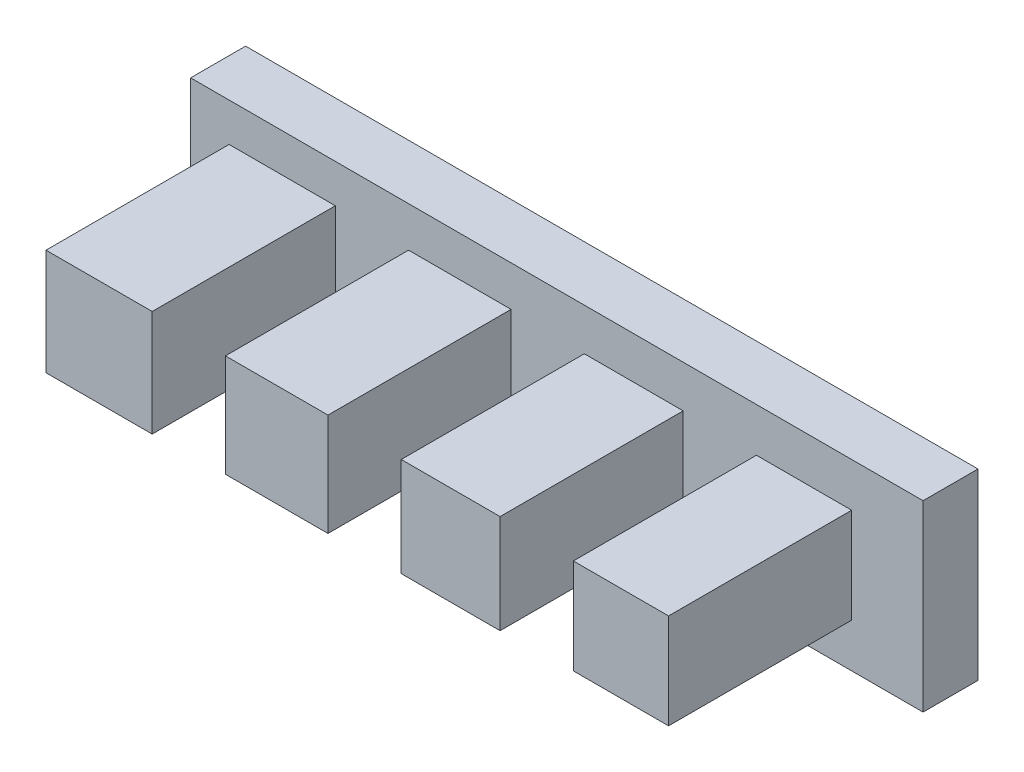
ISO-10303-21;
HEADER;
FILE_DESCRIPTION(('STEP AP214'),'2;1');
FILE_NAME('part.step','',(''),(''),'','','');
FILE_SCHEMA(('AUTOMOTIVE_DESIGN { 1 0 10303 214 1 1 1 1 }'));
ENDSEC;
DATA;
#1=APPLICATION_CONTEXT('core data for automotive mechanical design processes');
#2=APPLICATION_PROTOCOL_DEFINITION('international standard','automotive_design',2000,#1);
#3=PRODUCT_CONTEXT('',#1,'mechanical');
#4=PRODUCT('Part','Part','',(#3));
#5=PRODUCT_RELATED_PRODUCT_CATEGORY('part','',(#4));
#6=PRODUCT_DEFINITION_FORMATION('','',#4);
#7=PRODUCT_DEFINITION_CONTEXT('part definition',#1,'design');
#8=PRODUCT_DEFINITION('design','',#6,#7);
#9=PRODUCT_DEFINITION_SHAPE('','',#8);
#10=(LENGTH_UNIT() NAMED_UNIT(*) SI_UNIT(.MILLI.,.METRE.));
#11=(NAMED_UNIT(*) PLANE_ANGLE_UNIT() SI_UNIT($,.RADIAN.));
#12=(NAMED_UNIT(*) SI_UNIT($,.STERADIAN.) SOLID_ANGLE_UNIT());
#13=UNCERTAINTY_MEASURE_WITH_UNIT(LENGTH_MEASURE(1.E-05),#10,'distance_accuracy_value','');
#14=(GEOMETRIC_REPRESENTATION_CONTEXT(3) GLOBAL_UNCERTAINTY_ASSIGNED_CONTEXT((#13)) GLOBAL_UNIT_ASSIGNED_CONTEXT((#10,
#11,#12)) REPRESENTATION_CONTEXT('',''));
#15=CARTESIAN_POINT('',(0.,0.,0.));
#16=DIRECTION('',(0.,0.,1.));
#17=DIRECTION('',(1.,0.,0.));
#18=AXIS2_PLACEMENT_3D('',#15,#16,#17);
#19=CARTESIAN_POINT('',(0.,0.,1.5));
#20=DIRECTION('',(0.,0.,-1.));
#21=DIRECTION('',(-1.,0.,0.));
#22=AXIS2_PLACEMENT_3D('',#19,#20,#21);
#23=PLANE('',#22);
#24=DIRECTION('',(0.,-1.,0.));
#25=VECTOR('',#24,1.);
#26=CARTESIAN_POINT('',(10.75,3.85,1.5));
#27=LINE('',#26,#25);
#28=CARTESIAN_POINT('',(10.75,3.85,1.5));
#29=VERTEX_POINT('',#28);
#30=CARTESIAN_POINT('',(10.75,1.15,1.5));
#31=VERTEX_POINT('',#30);
#32=EDGE_CURVE('E191',#29,#31,#27,.T.);
#33=ORIENTED_EDGE('',*,*,#32,.F.);
#34=DIRECTION('',(-1.,0.,0.));
#35=VECTOR('',#34,1.);
#36=CARTESIAN_POINT('',(10.75,3.85,1.5));
#37=LINE('',#36,#35);
#38=CARTESIAN_POINT('',(13.45,3.85,1.5));
#39=VERTEX_POINT('',#38);
#40=EDGE_CURVE('E204',#39,#29,#37,.T.);
#41=ORIENTED_EDGE('',*,*,#40,.F.);
#42=DIRECTION('',(0.,1.,0.));
#43=VECTOR('',#42,1.);
#44=CARTESIAN_POINT('',(13.45,3.85,1.5));
#45=LINE('',#44,#43);
#46=CARTESIAN_POINT('',(13.45,1.15,1.5));
#47=VERTEX_POINT('',#46);
#48=EDGE_CURVE('E213',#47,#39,#45,.T.);
#49=ORIENTED_EDGE('',*,*,#48,.F.);
#50=DIRECTION('',(1.,0.,0.));
#51=VECTOR('',#50,1.);
#52=CARTESIAN_POINT('',(10.75,1.15,1.5));
#53=LINE('',#52,#51);
#54=EDGE_CURVE('E194',#31,#47,#53,.T.);
#55=ORIENTED_EDGE('',*,*,#54,.F.);
#56=EDGE_LOOP('',(#33,#41,#49,#55));
#57=FACE_BOUND('',#56,.T.);
#58=DIRECTION('',(0.,-1.,0.));
#59=VECTOR('',#58,1.);
#60=CARTESIAN_POINT('',(1.05,1.05,1.5));
#61=LINE('',#60,#59);
#62=CARTESIAN_POINT('',(1.05,3.95,1.5));
#63=VERTEX_POINT('',#62);
#64=CARTESIAN_POINT('',(1.05,1.05,1.5));
#65=VERTEX_POINT('',#64);
#66=EDGE_CURVE('E262',#63,#65,#61,.T.);
#67=ORIENTED_EDGE('',*,*,#66,.F.);
#68=DIRECTION('',(-1.,0.,0.));
#69=VECTOR('',#68,1.);
#70=CARTESIAN_POINT('',(1.05,3.95,1.5));
#71=LINE('',#70,#69);
#72=CARTESIAN_POINT('',(3.95,3.95,1.5));
#73=VERTEX_POINT('',#72);
#74=EDGE_CURVE('E267',#73,#63,#71,.T.);
#75=ORIENTED_EDGE('',*,*,#74,.F.);
#76=DIRECTION('',(0.,1.,0.));
#77=VECTOR('',#76,1.);
#78=CARTESIAN_POINT('',(3.95,1.05,1.5));
#79=LINE('',#78,#77);
#80=CARTESIAN_POINT('',(3.95,1.05,1.5));
#81=VERTEX_POINT('',#80);
#82=EDGE_CURVE('E279',#81,#73,#79,.T.);
#83=ORIENTED_EDGE('',*,*,#82,.F.);
#84=DIRECTION('',(1.,0.,0.));
#85=VECTOR('',#84,1.);
#86=CARTESIAN_POINT('',(1.05,1.05,1.5));
#87=LINE('',#86,#85);
#88=EDGE_CURVE('E276',#65,#81,#87,.T.);
#89=ORIENTED_EDGE('',*,*,#88,.F.);
#90=EDGE_LOOP('',(#67,#75,#83,#89));
#91=FACE_BOUND('',#90,.T.);
#92=DIRECTION('',(0.,-1.,0.));
#93=VECTOR('',#92,1.);
#94=CARTESIAN_POINT('',(0.,0.,1.5));
#95=LINE('',#94,#93);
#96=CARTESIAN_POINT('',(0.,5.,1.5));
#97=VERTEX_POINT('',#96);
#98=CARTESIAN_POINT('',(0.,0.,1.5));
#99=VERTEX_POINT('',#98);
#100=EDGE_CURVE('E296',#97,#99,#95,.T.);
#101=ORIENTED_EDGE('',*,*,#100,.T.);
#102=DIRECTION('',(1.,0.,0.));
#103=VECTOR('',#102,1.);
#104=CARTESIAN_POINT('',(0.,0.,1.5));
#105=LINE('',#104,#103);
#106=CARTESIAN_POINT('',(20.,0.,1.5));
#107=VERTEX_POINT('',#106);
#108=EDGE_CURVE('E299',#99,#107,#105,.T.);
#109=ORIENTED_EDGE('',*,*,#108,.T.);
#110=DIRECTION('',(0.,1.,0.));
#111=VECTOR('',#110,1.);
#112=CARTESIAN_POINT('',(20.,0.,1.5));
#113=LINE('',#112,#111);
#114=CARTESIAN_POINT('',(20.,5.,1.5));
#115=VERTEX_POINT('',#114);
#116=EDGE_CURVE('E302',#107,#115,#113,.T.);
#117=ORIENTED_EDGE('',*,*,#116,.T.);
#118=DIRECTION('',(-1.,0.,0.));
#119=VECTOR('',#118,1.);
#120=CARTESIAN_POINT('',(0.,5.,1.5));
#121=LINE('',#120,#119);
#122=EDGE_CURVE('E304',#115,#97,#121,.T.);
#123=ORIENTED_EDGE('',*,*,#122,.T.);
#124=EDGE_LOOP('',(#101,#109,#117,#123));
#125=FACE_BOUND('',#124,.T.);
#126=DIRECTION('',(0.,-1.,0.));
#127=VECTOR('',#126,1.);
#128=CARTESIAN_POINT('',(5.95,3.9,1.5));
#129=LINE('',#128,#127);
#130=CARTESIAN_POINT('',(5.95,3.9,1.5));
#131=VERTEX_POINT('',#130);
#132=CARTESIAN_POINT('',(5.95,1.1,1.5));
#133=VERTEX_POINT('',#132);
#134=EDGE_CURVE('E229',#131,#133,#129,.T.);
#135=ORIENTED_EDGE('',*,*,#134,.F.);
#136=DIRECTION('',(-1.,0.,0.));
#137=VECTOR('',#136,1.);
#138=CARTESIAN_POINT('',(5.95,3.9,1.5));
#139=LINE('',#138,#137);
#140=CARTESIAN_POINT('',(8.75,3.9,1.5));
#141=VERTEX_POINT('',#140);
#142=EDGE_CURVE('E234',#141,#131,#139,.T.);
#143=ORIENTED_EDGE('',*,*,#142,.F.);
#144=DIRECTION('',(0.,1.,0.));
#145=VECTOR('',#144,1.);
#146=CARTESIAN_POINT('',(8.75,3.9,1.5));
#147=LINE('',#146,#145);
#148=CARTESIAN_POINT('',(8.75,1.1,1.5));
#149=VERTEX_POINT('',#148);
#150=EDGE_CURVE('E246',#149,#141,#147,.T.);
#151=ORIENTED_EDGE('',*,*,#150,.F.);
#152=DIRECTION('',(1.,0.,0.));
#153=VECTOR('',#152,1.);
#154=CARTESIAN_POINT('',(5.95,1.1,1.5));
#155=LINE('',#154,#153);
#156=EDGE_CURVE('E243',#133,#149,#155,.T.);
#157=ORIENTED_EDGE('',*,*,#156,.F.);
#158=EDGE_LOOP('',(#135,#143,#151,#157));
#159=FACE_BOUND('',#158,.T.);
#160=DIRECTION('',(0.,-1.,0.));
#161=VECTOR('',#160,1.);
#162=CARTESIAN_POINT('',(15.45,3.8,1.5));
#163=LINE('',#162,#161);
#164=CARTESIAN_POINT('',(15.45,3.8,1.5));
#165=VERTEX_POINT('',#164);
#166=CARTESIAN_POINT('',(15.45,1.2,1.5));
#167=VERTEX_POINT('',#166);
#168=EDGE_CURVE('E190',#165,#167,#163,.T.);
#169=ORIENTED_EDGE('',*,*,#168,.F.);
#170=DIRECTION('',(-1.,0.,0.));
#171=VECTOR('',#170,1.);
#172=CARTESIAN_POINT('',(15.45,3.8,1.5));
#173=LINE('',#172,#171);
#174=CARTESIAN_POINT('',(18.05,3.8,1.5));
#175=VERTEX_POINT('',#174);
#176=EDGE_CURVE('E187',#175,#165,#173,.T.);
#177=ORIENTED_EDGE('',*,*,#176,.F.);
#178=DIRECTION('',(0.,1.,0.));
#179=VECTOR('',#178,1.);
#180=CARTESIAN_POINT('',(18.05,3.8,1.5));
#181=LINE('',#180,#179);
#182=CARTESIAN_POINT('',(18.05,1.2,1.5));
#183=VERTEX_POINT('',#182);
#184=EDGE_CURVE('E53',#183,#175,#181,.T.);
#185=ORIENTED_EDGE('',*,*,#184,.F.);
#186=DIRECTION('',(1.,0.,0.));
#187=VECTOR('',#186,1.);
#188=CARTESIAN_POINT('',(15.45,1.2,1.5));
#189=LINE('',#188,#187);
#190=EDGE_CURVE('E48',#167,#183,#189,.T.);
#191=ORIENTED_EDGE('',*,*,#190,.F.);
#192=EDGE_LOOP('',(#169,#177,#185,#191));
#193=FACE_BOUND('',#192,.T.);
#194=ADVANCED_FACE('F33',(#57,#91,#125,#159,#193),#23,.F.);
#195=CARTESIAN_POINT('',(0.,0.,1.5));
#196=DIRECTION('',(1.,0.,0.));
#197=DIRECTION('',(0.,0.,-1.));
#198=AXIS2_PLACEMENT_3D('',#195,#196,#197);
#199=PLANE('',#198);
#200=DIRECTION('',(0.,-1.,0.));
#201=VECTOR('',#200,1.);
#202=CARTESIAN_POINT('',(0.,0.,0.));
#203=LINE('',#202,#201);
#204=CARTESIAN_POINT('',(0.,5.,0.));
#205=VERTEX_POINT('',#204);
#206=CARTESIAN_POINT('',(0.,0.,0.));
#207=VERTEX_POINT('',#206);
#208=EDGE_CURVE('E295',#205,#207,#203,.T.);
#209=ORIENTED_EDGE('',*,*,#208,.T.);
#210=DIRECTION('',(0.,0.,-1.));
#211=VECTOR('',#210,1.);
#212=CARTESIAN_POINT('',(0.,0.,1.5));
#213=LINE('',#212,#211);
#214=EDGE_CURVE('E11',#99,#207,#213,.T.);
#215=ORIENTED_EDGE('',*,*,#214,.F.);
#216=ORIENTED_EDGE('',*,*,#100,.F.);
#217=DIRECTION('',(0.,0.,-1.));
#218=VECTOR('',#217,1.);
#219=CARTESIAN_POINT('',(0.,5.,1.5));
#220=LINE('',#219,#218);
#221=EDGE_CURVE('E306',#97,#205,#220,.T.);
#222=ORIENTED_EDGE('',*,*,#221,.T.);
#223=EDGE_LOOP('',(#209,#215,#216,#222));
#224=FACE_BOUND('',#223,.T.);
#225=ADVANCED_FACE('F35',(#224),#199,.F.);
#226=CARTESIAN_POINT('',(0.,0.,1.5));
#227=DIRECTION('',(0.,1.,0.));
#228=DIRECTION('',(0.,0.,1.));
#229=AXIS2_PLACEMENT_3D('',#226,#227,#228);
#230=PLANE('',#229);
#231=DIRECTION('',(1.,0.,0.));
#232=VECTOR('',#231,1.);
#233=CARTESIAN_POINT('',(0.,0.,0.));
#234=LINE('',#233,#232);
#235=CARTESIAN_POINT('',(20.,0.,0.));
#236=VERTEX_POINT('',#235);
#237=EDGE_CURVE('E309',#207,#236,#234,.T.);
#238=ORIENTED_EDGE('',*,*,#237,.T.);
#239=DIRECTION('',(0.,0.,-1.));
#240=VECTOR('',#239,1.);
#241=CARTESIAN_POINT('',(20.,0.,1.5));
#242=LINE('',#241,#240);
#243=EDGE_CURVE('E41',#107,#236,#242,.T.);
#244=ORIENTED_EDGE('',*,*,#243,.F.);
#245=ORIENTED_EDGE('',*,*,#108,.F.);
#246=ORIENTED_EDGE('',*,*,#214,.T.);
#247=EDGE_LOOP('',(#238,#244,#245,#246));
#248=FACE_BOUND('',#247,.T.);
#249=ADVANCED_FACE('F339',(#248),#230,.F.);
#250=CARTESIAN_POINT('',(20.,0.,1.5));
#251=DIRECTION('',(-1.,0.,0.));
#252=DIRECTION('',(0.,0.,1.));
#253=AXIS2_PLACEMENT_3D('',#250,#251,#252);
#254=PLANE('',#253);
#255=DIRECTION('',(0.,1.,0.));
#256=VECTOR('',#255,1.);
#257=CARTESIAN_POINT('',(20.,0.,0.));
#258=LINE('',#257,#256);
#259=CARTESIAN_POINT('',(20.,5.,0.));
#260=VERTEX_POINT('',#259);
#261=EDGE_CURVE('E311',#236,#260,#258,.T.);
#262=ORIENTED_EDGE('',*,*,#261,.T.);
#263=DIRECTION('',(0.,0.,-1.));
#264=VECTOR('',#263,1.);
#265=CARTESIAN_POINT('',(20.,5.,1.5));
#266=LINE('',#265,#264);
#267=EDGE_CURVE('E316',#115,#260,#266,.T.);
#268=ORIENTED_EDGE('',*,*,#267,.F.);
#269=ORIENTED_EDGE('',*,*,#116,.F.);
#270=ORIENTED_EDGE('',*,*,#243,.T.);
#271=EDGE_LOOP('',(#262,#268,#269,#270));
#272=FACE_BOUND('',#271,.T.);
#273=ADVANCED_FACE('F323',(#272),#254,.F.);
#274=CARTESIAN_POINT('',(0.,5.,1.5));
#275=DIRECTION('',(0.,-1.,0.));
#276=DIRECTION('',(0.,0.,-1.));
#277=AXIS2_PLACEMENT_3D('',#274,#275,#276);
#278=PLANE('',#277);
#279=DIRECTION('',(-1.,0.,0.));
#280=VECTOR('',#279,1.);
#281=CARTESIAN_POINT('',(0.,5.,0.));
#282=LINE('',#281,#280);
#283=EDGE_CURVE('E300',#260,#205,#282,.T.);
#284=ORIENTED_EDGE('',*,*,#283,.T.);
#285=ORIENTED_EDGE('',*,*,#221,.F.);
#286=ORIENTED_EDGE('',*,*,#122,.F.);
#287=ORIENTED_EDGE('',*,*,#267,.T.);
#288=EDGE_LOOP('',(#284,#285,#286,#287));
#289=FACE_BOUND('',#288,.T.);
#290=ADVANCED_FACE('F332',(#289),#278,.F.);
#291=CARTESIAN_POINT('',(0.,0.,0.));
#292=DIRECTION('',(0.,0.,-1.));
#293=DIRECTION('',(-1.,0.,0.));
#294=AXIS2_PLACEMENT_3D('',#291,#292,#293);
#295=PLANE('',#294);
#296=ORIENTED_EDGE('',*,*,#208,.F.);
#297=ORIENTED_EDGE('',*,*,#283,.F.);
#298=ORIENTED_EDGE('',*,*,#261,.F.);
#299=ORIENTED_EDGE('',*,*,#237,.F.);
#300=EDGE_LOOP('',(#296,#297,#298,#299));
#301=FACE_BOUND('',#300,.T.);
#302=ADVANCED_FACE('F329',(#301),#295,.T.);
#303=CARTESIAN_POINT('',(1.05,1.05,6.5));
#304=DIRECTION('',(1.,0.,0.));
#305=DIRECTION('',(0.,1.,0.));
#306=AXIS2_PLACEMENT_3D('',#303,#304,#305);
#307=PLANE('',#306);
#308=ORIENTED_EDGE('',*,*,#66,.T.);
#309=DIRECTION('',(0.,0.,-1.));
#310=VECTOR('',#309,1.);
#311=CARTESIAN_POINT('',(1.05,1.05,6.5));
#312=LINE('',#311,#310);
#313=CARTESIAN_POINT('',(1.05,1.05,6.5));
#314=VERTEX_POINT('',#313);
#315=EDGE_CURVE('E292',#314,#65,#312,.T.);
#316=ORIENTED_EDGE('',*,*,#315,.F.);
#317=DIRECTION('',(0.,-1.,0.));
#318=VECTOR('',#317,1.);
#319=CARTESIAN_POINT('',(1.05,1.05,6.5));
#320=LINE('',#319,#318);
#321=CARTESIAN_POINT('',(1.05,3.95,6.5));
#322=VERTEX_POINT('',#321);
#323=EDGE_CURVE('E263',#322,#314,#320,.T.);
#324=ORIENTED_EDGE('',*,*,#323,.F.);
#325=DIRECTION('',(0.,0.,-1.));
#326=VECTOR('',#325,1.);
#327=CARTESIAN_POINT('',(1.05,3.95,6.5));
#328=LINE('',#327,#326);
#329=EDGE_CURVE('E273',#322,#63,#328,.T.);
#330=ORIENTED_EDGE('',*,*,#329,.T.);
#331=EDGE_LOOP('',(#308,#316,#324,#330));
#332=FACE_BOUND('',#331,.T.);
#333=ADVANCED_FACE('F354',(#332),#307,.F.);
#334=CARTESIAN_POINT('',(1.05,1.05,6.5));
#335=DIRECTION('',(0.,1.,0.));
#336=DIRECTION('',(0.,0.,1.));
#337=AXIS2_PLACEMENT_3D('',#334,#335,#336);
#338=PLANE('',#337);
#339=ORIENTED_EDGE('',*,*,#88,.T.);
#340=DIRECTION('',(0.,0.,-1.));
#341=VECTOR('',#340,1.);
#342=CARTESIAN_POINT('',(3.95,1.05,6.5));
#343=LINE('',#342,#341);
#344=CARTESIAN_POINT('',(3.95,1.05,6.5));
#345=VERTEX_POINT('',#344);
#346=EDGE_CURVE('E289',#345,#81,#343,.T.);
#347=ORIENTED_EDGE('',*,*,#346,.F.);
#348=DIRECTION('',(1.,0.,0.));
#349=VECTOR('',#348,1.);
#350=CARTESIAN_POINT('',(1.05,1.05,6.5));
#351=LINE('',#350,#349);
#352=EDGE_CURVE('E266',#314,#345,#351,.T.);
#353=ORIENTED_EDGE('',*,*,#352,.F.);
#354=ORIENTED_EDGE('',*,*,#315,.T.);
#355=EDGE_LOOP('',(#339,#347,#353,#354));
#356=FACE_BOUND('',#355,.T.);
#357=ADVANCED_FACE('F373',(#356),#338,.F.);
#358=CARTESIAN_POINT('',(3.95,1.05,6.5));
#359=DIRECTION('',(-1.,0.,0.));
#360=DIRECTION('',(0.,0.,1.));
#361=AXIS2_PLACEMENT_3D('',#358,#359,#360);
#362=PLANE('',#361);
#363=ORIENTED_EDGE('',*,*,#82,.T.);
#364=DIRECTION('',(0.,0.,-1.));
#365=VECTOR('',#364,1.);
#366=CARTESIAN_POINT('',(3.95,3.95,6.5));
#367=LINE('',#366,#365);
#368=CARTESIAN_POINT('',(3.95,3.95,6.5));
#369=VERTEX_POINT('',#368);
#370=EDGE_CURVE('E286',#369,#73,#367,.T.);
#371=ORIENTED_EDGE('',*,*,#370,.F.);
#372=DIRECTION('',(0.,1.,0.));
#373=VECTOR('',#372,1.);
#374=CARTESIAN_POINT('',(3.95,1.05,6.5));
#375=LINE('',#374,#373);
#376=EDGE_CURVE('E269',#345,#369,#375,.T.);
#377=ORIENTED_EDGE('',*,*,#376,.F.);
#378=ORIENTED_EDGE('',*,*,#346,.T.);
#379=EDGE_LOOP('',(#363,#371,#377,#378));
#380=FACE_BOUND('',#379,.T.);
#381=ADVANCED_FACE('F380',(#380),#362,.F.);
#382=CARTESIAN_POINT('',(1.05,3.95,6.5));
#383=DIRECTION('',(0.,-1.,0.));
#384=DIRECTION('',(0.,0.,-1.));
#385=AXIS2_PLACEMENT_3D('',#382,#383,#384);
#386=PLANE('',#385);
#387=ORIENTED_EDGE('',*,*,#74,.T.);
#388=ORIENTED_EDGE('',*,*,#329,.F.);
#389=DIRECTION('',(-1.,0.,0.));
#390=VECTOR('',#389,1.);
#391=CARTESIAN_POINT('',(1.05,3.95,6.5));
#392=LINE('',#391,#390);
#393=EDGE_CURVE('E271',#369,#322,#392,.T.);
#394=ORIENTED_EDGE('',*,*,#393,.F.);
#395=ORIENTED_EDGE('',*,*,#370,.T.);
#396=EDGE_LOOP('',(#387,#388,#394,#395));
#397=FACE_BOUND('',#396,.T.);
#398=ADVANCED_FACE('F387',(#397),#386,.F.);
#399=CARTESIAN_POINT('',(0.,0.,6.5));
#400=DIRECTION('',(0.,0.,-1.));
#401=DIRECTION('',(-1.,0.,0.));
#402=AXIS2_PLACEMENT_3D('',#399,#400,#401);
#403=PLANE('',#402);
#404=ORIENTED_EDGE('',*,*,#323,.T.);
#405=ORIENTED_EDGE('',*,*,#352,.T.);
#406=ORIENTED_EDGE('',*,*,#376,.T.);
#407=ORIENTED_EDGE('',*,*,#393,.T.);
#408=EDGE_LOOP('',(#404,#405,#406,#407));
#409=FACE_BOUND('',#408,.T.);
#410=ADVANCED_FACE('F395',(#409),#403,.F.);
#411=CARTESIAN_POINT('',(5.95,3.9,6.5));
#412=DIRECTION('',(1.,0.,0.));
#413=DIRECTION('',(0.,0.,-1.));
#414=AXIS2_PLACEMENT_3D('',#411,#412,#413);
#415=PLANE('',#414);
#416=ORIENTED_EDGE('',*,*,#134,.T.);
#417=DIRECTION('',(0.,0.,-1.));
#418=VECTOR('',#417,1.);
#419=CARTESIAN_POINT('',(5.95,1.1,6.5));
#420=LINE('',#419,#418);
#421=CARTESIAN_POINT('',(5.95,1.1,6.5));
#422=VERTEX_POINT('',#421);
#423=EDGE_CURVE('E259',#422,#133,#420,.T.);
#424=ORIENTED_EDGE('',*,*,#423,.F.);
#425=DIRECTION('',(0.,-1.,0.));
#426=VECTOR('',#425,1.);
#427=CARTESIAN_POINT('',(5.95,3.9,6.5));
#428=LINE('',#427,#426);
#429=CARTESIAN_POINT('',(5.95,3.9,6.5));
#430=VERTEX_POINT('',#429);
#431=EDGE_CURVE('E230',#430,#422,#428,.T.);
#432=ORIENTED_EDGE('',*,*,#431,.F.);
#433=DIRECTION('',(0.,0.,-1.));
#434=VECTOR('',#433,1.);
#435=CARTESIAN_POINT('',(5.95,3.9,6.5));
#436=LINE('',#435,#434);
#437=EDGE_CURVE('E240',#430,#131,#436,.T.);
#438=ORIENTED_EDGE('',*,*,#437,.T.);
#439=EDGE_LOOP('',(#416,#424,#432,#438));
#440=FACE_BOUND('',#439,.T.);
#441=ADVANCED_FACE('F403',(#440),#415,.F.);
#442=CARTESIAN_POINT('',(5.95,1.1,6.5));
#443=DIRECTION('',(0.,1.,0.));
#444=DIRECTION('',(0.,0.,1.));
#445=AXIS2_PLACEMENT_3D('',#442,#443,#444);
#446=PLANE('',#445);
#447=ORIENTED_EDGE('',*,*,#156,.T.);
#448=DIRECTION('',(0.,0.,-1.));
#449=VECTOR('',#448,1.);
#450=CARTESIAN_POINT('',(8.75,1.1,6.5));
#451=LINE('',#450,#449);
#452=CARTESIAN_POINT('',(8.75,1.1,6.5));
#453=VERTEX_POINT('',#452);
#454=EDGE_CURVE('E256',#453,#149,#451,.T.);
#455=ORIENTED_EDGE('',*,*,#454,.F.);
#456=DIRECTION('',(1.,0.,0.));
#457=VECTOR('',#456,1.);
#458=CARTESIAN_POINT('',(5.95,1.1,6.5));
#459=LINE('',#458,#457);
#460=EDGE_CURVE('E233',#422,#453,#459,.T.);
#461=ORIENTED_EDGE('',*,*,#460,.F.);
#462=ORIENTED_EDGE('',*,*,#423,.T.);
#463=EDGE_LOOP('',(#447,#455,#461,#462));
#464=FACE_BOUND('',#463,.T.);
#465=ADVANCED_FACE('F411',(#464),#446,.F.);
#466=CARTESIAN_POINT('',(8.75,3.9,6.5));
#467=DIRECTION('',(-1.,0.,0.));
#468=DIRECTION('',(0.,0.,1.));
#469=AXIS2_PLACEMENT_3D('',#466,#467,#468);
#470=PLANE('',#469);
#471=ORIENTED_EDGE('',*,*,#150,.T.);
#472=DIRECTION('',(0.,0.,-1.));
#473=VECTOR('',#472,1.);
#474=CARTESIAN_POINT('',(8.75,3.9,6.5));
#475=LINE('',#474,#473);
#476=CARTESIAN_POINT('',(8.75,3.9,6.5));
#477=VERTEX_POINT('',#476);
#478=EDGE_CURVE('E253',#477,#141,#475,.T.);
#479=ORIENTED_EDGE('',*,*,#478,.F.);
#480=DIRECTION('',(0.,1.,0.));
#481=VECTOR('',#480,1.);
#482=CARTESIAN_POINT('',(8.75,3.9,6.5));
#483=LINE('',#482,#481);
#484=EDGE_CURVE('E236',#453,#477,#483,.T.);
#485=ORIENTED_EDGE('',*,*,#484,.F.);
#486=ORIENTED_EDGE('',*,*,#454,.T.);
#487=EDGE_LOOP('',(#471,#479,#485,#486));
#488=FACE_BOUND('',#487,.T.);
#489=ADVANCED_FACE('F419',(#488),#470,.F.);
#490=CARTESIAN_POINT('',(5.95,3.9,6.5));
#491=DIRECTION('',(0.,-1.,0.));
#492=DIRECTION('',(0.,0.,-1.));
#493=AXIS2_PLACEMENT_3D('',#490,#491,#492);
#494=PLANE('',#493);
#495=ORIENTED_EDGE('',*,*,#142,.T.);
#496=ORIENTED_EDGE('',*,*,#437,.F.);
#497=DIRECTION('',(-1.,0.,0.));
#498=VECTOR('',#497,1.);
#499=CARTESIAN_POINT('',(5.95,3.9,6.5));
#500=LINE('',#499,#498);
#501=EDGE_CURVE('E238',#477,#430,#500,.T.);
#502=ORIENTED_EDGE('',*,*,#501,.F.);
#503=ORIENTED_EDGE('',*,*,#478,.T.);
#504=EDGE_LOOP('',(#495,#496,#502,#503));
#505=FACE_BOUND('',#504,.T.);
#506=ADVANCED_FACE('F427',(#505),#494,.F.);
#507=CARTESIAN_POINT('',(0.,0.,6.5));
#508=DIRECTION('',(0.,0.,1.));
#509=DIRECTION('',(1.,0.,0.));
#510=AXIS2_PLACEMENT_3D('',#507,#508,#509);
#511=PLANE('',#510);
#512=ORIENTED_EDGE('',*,*,#431,.T.);
#513=ORIENTED_EDGE('',*,*,#460,.T.);
#514=ORIENTED_EDGE('',*,*,#484,.T.);
#515=ORIENTED_EDGE('',*,*,#501,.T.);
#516=EDGE_LOOP('',(#512,#513,#514,#515));
#517=FACE_BOUND('',#516,.T.);
#518=ADVANCED_FACE('F435',(#517),#511,.T.);
#519=CARTESIAN_POINT('',(10.75,3.85,6.5));
#520=DIRECTION('',(1.,0.,0.));
#521=DIRECTION('',(0.,0.,-1.));
#522=AXIS2_PLACEMENT_3D('',#519,#520,#521);
#523=PLANE('',#522);
#524=ORIENTED_EDGE('',*,*,#32,.T.);
#525=DIRECTION('',(0.,0.,-1.));
#526=VECTOR('',#525,1.);
#527=CARTESIAN_POINT('',(10.75,1.15,6.5));
#528=LINE('',#527,#526);
#529=CARTESIAN_POINT('',(10.75,1.15,6.5));
#530=VERTEX_POINT('',#529);
#531=EDGE_CURVE('E226',#530,#31,#528,.T.);
#532=ORIENTED_EDGE('',*,*,#531,.F.);
#533=DIRECTION('',(0.,-1.,0.));
#534=VECTOR('',#533,1.);
#535=CARTESIAN_POINT('',(10.75,3.85,6.5));
#536=LINE('',#535,#534);
#537=CARTESIAN_POINT('',(10.75,3.85,6.5));
#538=VERTEX_POINT('',#537);
#539=EDGE_CURVE('E200',#538,#530,#536,.T.);
#540=ORIENTED_EDGE('',*,*,#539,.F.);
#541=DIRECTION('',(0.,0.,-1.));
#542=VECTOR('',#541,1.);
#543=CARTESIAN_POINT('',(10.75,3.85,6.5));
#544=LINE('',#543,#542);
#545=EDGE_CURVE('E209',#538,#29,#544,.T.);
#546=ORIENTED_EDGE('',*,*,#545,.T.);
#547=EDGE_LOOP('',(#524,#532,#540,#546));
#548=FACE_BOUND('',#547,.T.);
#549=ADVANCED_FACE('F443',(#548),#523,.F.);
#550=CARTESIAN_POINT('',(10.75,1.15,6.5));
#551=DIRECTION('',(0.,1.,0.));
#552=DIRECTION('',(0.,0.,1.));
#553=AXIS2_PLACEMENT_3D('',#550,#551,#552);
#554=PLANE('',#553);
#555=ORIENTED_EDGE('',*,*,#54,.T.);
#556=DIRECTION('',(0.,0.,-1.));
#557=VECTOR('',#556,1.);
#558=CARTESIAN_POINT('',(13.45,1.15,6.5));
#559=LINE('',#558,#557);
#560=CARTESIAN_POINT('',(13.45,1.15,6.5));
#561=VERTEX_POINT('',#560);
#562=EDGE_CURVE('E223',#561,#47,#559,.T.);
#563=ORIENTED_EDGE('',*,*,#562,.F.);
#564=DIRECTION('',(1.,0.,0.));
#565=VECTOR('',#564,1.);
#566=CARTESIAN_POINT('',(10.75,1.15,6.5));
#567=LINE('',#566,#565);
#568=EDGE_CURVE('E203',#530,#561,#567,.T.);
#569=ORIENTED_EDGE('',*,*,#568,.F.);
#570=ORIENTED_EDGE('',*,*,#531,.T.);
#571=EDGE_LOOP('',(#555,#563,#569,#570));
#572=FACE_BOUND('',#571,.T.);
#573=ADVANCED_FACE('F451',(#572),#554,.F.);
#574=CARTESIAN_POINT('',(13.45,3.85,6.5));
#575=DIRECTION('',(-1.,0.,0.));
#576=DIRECTION('',(0.,0.,1.));
#577=AXIS2_PLACEMENT_3D('',#574,#575,#576);
#578=PLANE('',#577);
#579=ORIENTED_EDGE('',*,*,#48,.T.);
#580=DIRECTION('',(0.,0.,-1.));
#581=VECTOR('',#580,1.);
#582=CARTESIAN_POINT('',(13.45,3.85,6.5));
#583=LINE('',#582,#581);
#584=CARTESIAN_POINT('',(13.45,3.85,6.5));
#585=VERTEX_POINT('',#584);
#586=EDGE_CURVE('E220',#585,#39,#583,.T.);
#587=ORIENTED_EDGE('',*,*,#586,.F.);
#588=DIRECTION('',(0.,1.,0.));
#589=VECTOR('',#588,1.);
#590=CARTESIAN_POINT('',(13.45,3.85,6.5));
#591=LINE('',#590,#589);
#592=EDGE_CURVE('E206',#561,#585,#591,.T.);
#593=ORIENTED_EDGE('',*,*,#592,.F.);
#594=ORIENTED_EDGE('',*,*,#562,.T.);
#595=EDGE_LOOP('',(#579,#587,#593,#594));
#596=FACE_BOUND('',#595,.T.);
#597=ADVANCED_FACE('F459',(#596),#578,.F.);
#598=CARTESIAN_POINT('',(10.75,3.85,6.5));
#599=DIRECTION('',(0.,-1.,0.));
#600=DIRECTION('',(0.,0.,-1.));
#601=AXIS2_PLACEMENT_3D('',#598,#599,#600);
#602=PLANE('',#601);
#603=ORIENTED_EDGE('',*,*,#40,.T.);
#604=ORIENTED_EDGE('',*,*,#545,.F.);
#605=DIRECTION('',(-1.,0.,0.));
#606=VECTOR('',#605,1.);
#607=CARTESIAN_POINT('',(10.75,3.85,6.5));
#608=LINE('',#607,#606);
#609=EDGE_CURVE('E208',#585,#538,#608,.T.);
#610=ORIENTED_EDGE('',*,*,#609,.F.);
#611=ORIENTED_EDGE('',*,*,#586,.T.);
#612=EDGE_LOOP('',(#603,#604,#610,#611));
#613=FACE_BOUND('',#612,.T.);
#614=ADVANCED_FACE('F467',(#613),#602,.F.);
#615=CARTESIAN_POINT('',(0.,0.,6.5));
#616=DIRECTION('',(0.,0.,1.));
#617=DIRECTION('',(1.,0.,0.));
#618=AXIS2_PLACEMENT_3D('',#615,#616,#617);
#619=PLANE('',#618);
#620=ORIENTED_EDGE('',*,*,#539,.T.);
#621=ORIENTED_EDGE('',*,*,#568,.T.);
#622=ORIENTED_EDGE('',*,*,#592,.T.);
#623=ORIENTED_EDGE('',*,*,#609,.T.);
#624=EDGE_LOOP('',(#620,#621,#622,#623));
#625=FACE_BOUND('',#624,.T.);
#626=ADVANCED_FACE('F475',(#625),#619,.T.);
#627=CARTESIAN_POINT('',(15.45,3.8,6.5));
#628=DIRECTION('',(1.,0.,0.));
#629=DIRECTION('',(0.,0.,-1.));
#630=AXIS2_PLACEMENT_3D('',#627,#628,#629);
#631=PLANE('',#630);
#632=ORIENTED_EDGE('',*,*,#168,.T.);
#633=DIRECTION('',(0.,0.,-1.));
#634=VECTOR('',#633,1.);
#635=CARTESIAN_POINT('',(15.45,1.2,6.5));
#636=LINE('',#635,#634);
#637=CARTESIAN_POINT('',(15.45,1.2,6.5));
#638=VERTEX_POINT('',#637);
#639=EDGE_CURVE('E171',#638,#167,#636,.T.);
#640=ORIENTED_EDGE('',*,*,#639,.F.);
#641=DIRECTION('',(0.,-1.,0.));
#642=VECTOR('',#641,1.);
#643=CARTESIAN_POINT('',(15.45,3.8,6.5));
#644=LINE('',#643,#642);
#645=CARTESIAN_POINT('',(15.45,3.8,6.5));
#646=VERTEX_POINT('',#645);
#647=EDGE_CURVE('E178',#646,#638,#644,.T.);
#648=ORIENTED_EDGE('',*,*,#647,.F.);
#649=DIRECTION('',(0.,0.,-1.));
#650=VECTOR('',#649,1.);
#651=CARTESIAN_POINT('',(15.45,3.8,6.5));
#652=LINE('',#651,#650);
#653=EDGE_CURVE('E584',#646,#165,#652,.T.);
#654=ORIENTED_EDGE('',*,*,#653,.T.);
#655=EDGE_LOOP('',(#632,#640,#648,#654));
#656=FACE_BOUND('',#655,.T.);
#657=ADVANCED_FACE('F189',(#656),#631,.F.);
#658=CARTESIAN_POINT('',(15.45,1.2,6.5));
#659=DIRECTION('',(0.,1.,0.));
#660=DIRECTION('',(0.,0.,1.));
#661=AXIS2_PLACEMENT_3D('',#658,#659,#660);
#662=PLANE('',#661);
#663=ORIENTED_EDGE('',*,*,#190,.T.);
#664=DIRECTION('',(0.,0.,-1.));
#665=VECTOR('',#664,1.);
#666=CARTESIAN_POINT('',(18.05,1.2,6.5));
#667=LINE('',#666,#665);
#668=CARTESIAN_POINT('',(18.05,1.2,6.5));
#669=VERTEX_POINT('',#668);
#670=EDGE_CURVE('E174',#669,#183,#667,.T.);
#671=ORIENTED_EDGE('',*,*,#670,.F.);
#672=DIRECTION('',(1.,0.,0.));
#673=VECTOR('',#672,1.);
#674=CARTESIAN_POINT('',(15.45,1.2,6.5));
#675=LINE('',#674,#673);
#676=EDGE_CURVE('E167',#638,#669,#675,.T.);
#677=ORIENTED_EDGE('',*,*,#676,.F.);
#678=ORIENTED_EDGE('',*,*,#639,.T.);
#679=EDGE_LOOP('',(#663,#671,#677,#678));
#680=FACE_BOUND('',#679,.T.);
#681=ADVANCED_FACE('F169',(#680),#662,.F.);
#682=CARTESIAN_POINT('',(18.05,3.8,6.5));
#683=DIRECTION('',(-1.,0.,0.));
#684=DIRECTION('',(0.,-1.,0.));
#685=AXIS2_PLACEMENT_3D('',#682,#683,#684);
#686=PLANE('',#685);
#687=ORIENTED_EDGE('',*,*,#184,.T.);
#688=DIRECTION('',(0.,0.,-1.));
#689=VECTOR('',#688,1.);
#690=CARTESIAN_POINT('',(18.05,3.8,6.5));
#691=LINE('',#690,#689);
#692=CARTESIAN_POINT('',(18.05,3.8,6.5));
#693=VERTEX_POINT('',#692);
#694=EDGE_CURVE('E196',#693,#175,#691,.T.);
#695=ORIENTED_EDGE('',*,*,#694,.F.);
#696=DIRECTION('',(0.,1.,0.));
#697=VECTOR('',#696,1.);
#698=CARTESIAN_POINT('',(18.05,3.8,6.5));
#699=LINE('',#698,#697);
#700=EDGE_CURVE('E177',#669,#693,#699,.T.);
#701=ORIENTED_EDGE('',*,*,#700,.F.);
#702=ORIENTED_EDGE('',*,*,#670,.T.);
#703=EDGE_LOOP('',(#687,#695,#701,#702));
#704=FACE_BOUND('',#703,.T.);
#705=ADVANCED_FACE('F496',(#704),#686,.F.);
#706=CARTESIAN_POINT('',(15.45,3.8,6.5));
#707=DIRECTION('',(0.,-1.,0.));
#708=DIRECTION('',(0.,0.,-1.));
#709=AXIS2_PLACEMENT_3D('',#706,#707,#708);
#710=PLANE('',#709);
#711=ORIENTED_EDGE('',*,*,#176,.T.);
#712=ORIENTED_EDGE('',*,*,#653,.F.);
#713=DIRECTION('',(-1.,0.,0.));
#714=VECTOR('',#713,1.);
#715=CARTESIAN_POINT('',(15.45,3.8,6.5));
#716=LINE('',#715,#714);
#717=EDGE_CURVE('E183',#693,#646,#716,.T.);
#718=ORIENTED_EDGE('',*,*,#717,.F.);
#719=ORIENTED_EDGE('',*,*,#694,.T.);
#720=EDGE_LOOP('',(#711,#712,#718,#719));
#721=FACE_BOUND('',#720,.T.);
#722=ADVANCED_FACE('F503',(#721),#710,.F.);
#723=CARTESIAN_POINT('',(0.,0.,6.5));
#724=DIRECTION('',(0.,0.,1.));
#725=DIRECTION('',(1.,0.,0.));
#726=AXIS2_PLACEMENT_3D('',#723,#724,#725);
#727=PLANE('',#726);
#728=ORIENTED_EDGE('',*,*,#647,.T.);
#729=ORIENTED_EDGE('',*,*,#676,.T.);
#730=ORIENTED_EDGE('',*,*,#700,.T.);
#731=ORIENTED_EDGE('',*,*,#717,.T.);
#732=EDGE_LOOP('',(#728,#729,#730,#731));
#733=FACE_BOUND('',#732,.T.);
#734=ADVANCED_FACE('F181',(#733),#727,.T.);
#735=CLOSED_SHELL('',(#194,#225,#249,#273,#290,#302,#333,#357,#381,#398,#410,#441,#465,#489,
#506,#518,#549,#573,#597,#614,#626,#657,#681,#705,#722,#734));
#736=MANIFOLD_SOLID_BREP('B2',#735);
#737=ADVANCED_BREP_SHAPE_REPRESENTATION('',(#18,#736),#14);
#738=SHAPE_DEFINITION_REPRESENTATION(#9,#737);
ENDSEC;
END-ISO-10303-21;
